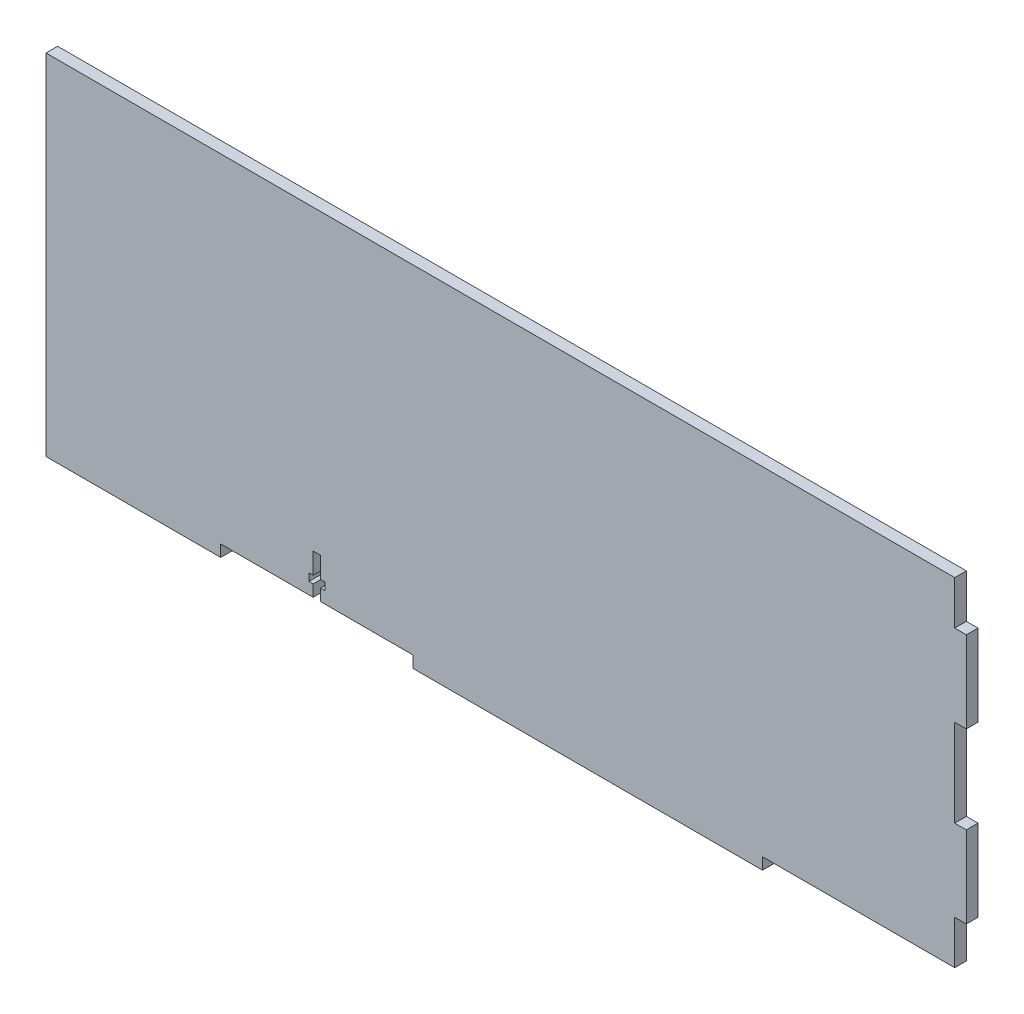
ISO-10303-21;
HEADER;
FILE_DESCRIPTION(('STEP AP214'),'2;1');
FILE_NAME('part.step','',(''),(''),'','','');
FILE_SCHEMA(('AUTOMOTIVE_DESIGN { 1 0 10303 214 1 1 1 1 }'));
ENDSEC;
DATA;
#1=APPLICATION_CONTEXT('core data for automotive mechanical design processes');
#2=APPLICATION_PROTOCOL_DEFINITION('international standard','automotive_design',2000,#1);
#3=PRODUCT_CONTEXT('',#1,'mechanical');
#4=PRODUCT('Part','Part','',(#3));
#5=PRODUCT_RELATED_PRODUCT_CATEGORY('part','',(#4));
#6=PRODUCT_DEFINITION_FORMATION('','',#4);
#7=PRODUCT_DEFINITION_CONTEXT('part definition',#1,'design');
#8=PRODUCT_DEFINITION('design','',#6,#7);
#9=PRODUCT_DEFINITION_SHAPE('','',#8);
#10=(LENGTH_UNIT() NAMED_UNIT(*) SI_UNIT(.MILLI.,.METRE.));
#11=(NAMED_UNIT(*) PLANE_ANGLE_UNIT() SI_UNIT($,.RADIAN.));
#12=(NAMED_UNIT(*) SI_UNIT($,.STERADIAN.) SOLID_ANGLE_UNIT());
#13=UNCERTAINTY_MEASURE_WITH_UNIT(LENGTH_MEASURE(1.E-05),#10,'distance_accuracy_value','');
#14=(GEOMETRIC_REPRESENTATION_CONTEXT(3) GLOBAL_UNCERTAINTY_ASSIGNED_CONTEXT((#13)) GLOBAL_UNIT_ASSIGNED_CONTEXT((#10,
#11,#12)) REPRESENTATION_CONTEXT('',''));
#15=CARTESIAN_POINT('',(0.,0.,0.));
#16=DIRECTION('',(0.,0.,1.));
#17=DIRECTION('',(1.,0.,0.));
#18=AXIS2_PLACEMENT_3D('',#15,#16,#17);
#19=CARTESIAN_POINT('',(0.,0.,5.));
#20=DIRECTION('',(0.,1.,0.));
#21=DIRECTION('',(0.,0.,1.));
#22=AXIS2_PLACEMENT_3D('',#19,#20,#21);
#23=PLANE('',#22);
#24=DIRECTION('',(0.,0.,1.));
#25=VECTOR('',#24,1.);
#26=CARTESIAN_POINT('',(504.65,-1.43484853190606E-13,-5.));
#27=LINE('',#26,#25);
#28=CARTESIAN_POINT('',(504.65,-1.43484853190606E-13,0.));
#29=VERTEX_POINT('',#28);
#30=CARTESIAN_POINT('',(504.65,-1.43484853190606E-13,5.));
#31=VERTEX_POINT('',#30);
#32=EDGE_CURVE('E751',#29,#31,#27,.T.);
#33=ORIENTED_EDGE('',*,*,#32,.T.);
#34=DIRECTION('',(1.,0.,0.));
#35=VECTOR('',#34,1.);
#36=CARTESIAN_POINT('',(0.,0.,5.));
#37=LINE('',#36,#35);
#38=CARTESIAN_POINT('',(465.,0.,5.));
#39=VERTEX_POINT('',#38);
#40=EDGE_CURVE('E624',#39,#31,#37,.T.);
#41=ORIENTED_EDGE('',*,*,#40,.F.);
#42=DIRECTION('',(0.,0.,-1.));
#43=VECTOR('',#42,1.);
#44=CARTESIAN_POINT('',(465.,0.,5.));
#45=LINE('',#44,#43);
#46=CARTESIAN_POINT('',(465.,0.,0.));
#47=VERTEX_POINT('',#46);
#48=EDGE_CURVE('E675',#39,#47,#45,.T.);
#49=ORIENTED_EDGE('',*,*,#48,.T.);
#50=DIRECTION('',(1.,0.,0.));
#51=VECTOR('',#50,1.);
#52=CARTESIAN_POINT('',(0.,0.,0.));
#53=LINE('',#52,#51);
#54=EDGE_CURVE('E640',#47,#29,#53,.T.);
#55=ORIENTED_EDGE('',*,*,#54,.T.);
#56=EDGE_LOOP('',(#33,#41,#49,#55));
#57=FACE_BOUND('',#56,.T.);
#58=ADVANCED_FACE('F397',(#57),#23,.F.);
#59=CARTESIAN_POINT('',(697.5,0.,0.));
#60=VERTEX_POINT('',#59);
#61=CARTESIAN_POINT('',(780.,0.,0.));
#62=VERTEX_POINT('',#61);
#63=EDGE_CURVE('E642',#60,#62,#53,.T.);
#64=ORIENTED_EDGE('',*,*,#63,.T.);
#65=DIRECTION('',(0.,0.,-1.));
#66=VECTOR('',#65,1.);
#67=CARTESIAN_POINT('',(780.,0.,5.));
#68=LINE('',#67,#66);
#69=CARTESIAN_POINT('',(780.,0.,5.));
#70=VERTEX_POINT('',#69);
#71=EDGE_CURVE('E663',#70,#62,#68,.T.);
#72=ORIENTED_EDGE('',*,*,#71,.F.);
#73=CARTESIAN_POINT('',(697.5,0.,5.));
#74=VERTEX_POINT('',#73);
#75=EDGE_CURVE('E630',#74,#70,#37,.T.);
#76=ORIENTED_EDGE('',*,*,#75,.F.);
#77=DIRECTION('',(0.,0.,-1.));
#78=VECTOR('',#77,1.);
#79=CARTESIAN_POINT('',(697.5,0.,5.));
#80=LINE('',#79,#78);
#81=EDGE_CURVE('E666',#74,#60,#80,.T.);
#82=ORIENTED_EDGE('',*,*,#81,.T.);
#83=EDGE_LOOP('',(#64,#72,#76,#82));
#84=FACE_BOUND('',#83,.T.);
#85=ADVANCED_FACE('F902',(#84),#23,.F.);
#86=CARTESIAN_POINT('',(507.85,-1.48689023618536E-13,5.));
#87=VERTEX_POINT('',#86);
#88=CARTESIAN_POINT('',(547.5,0.,5.));
#89=VERTEX_POINT('',#88);
#90=EDGE_CURVE('E614',#87,#89,#37,.T.);
#91=ORIENTED_EDGE('',*,*,#90,.F.);
#92=DIRECTION('',(0.,0.,1.));
#93=VECTOR('',#92,1.);
#94=CARTESIAN_POINT('',(507.85,-1.48689023618536E-13,-5.));
#95=LINE('',#94,#93);
#96=CARTESIAN_POINT('',(507.85,-1.48689023618536E-13,0.));
#97=VERTEX_POINT('',#96);
#98=EDGE_CURVE('E865',#97,#87,#95,.T.);
#99=ORIENTED_EDGE('',*,*,#98,.F.);
#100=CARTESIAN_POINT('',(547.5,0.,0.));
#101=VERTEX_POINT('',#100);
#102=EDGE_CURVE('E638',#97,#101,#53,.T.);
#103=ORIENTED_EDGE('',*,*,#102,.T.);
#104=DIRECTION('',(0.,0.,-1.));
#105=VECTOR('',#104,1.);
#106=CARTESIAN_POINT('',(547.5,0.,5.));
#107=LINE('',#106,#105);
#108=EDGE_CURVE('E672',#89,#101,#107,.T.);
#109=ORIENTED_EDGE('',*,*,#108,.F.);
#110=EDGE_LOOP('',(#91,#99,#103,#109));
#111=FACE_BOUND('',#110,.T.);
#112=ADVANCED_FACE('F891',(#111),#23,.F.);
#113=CARTESIAN_POINT('',(780.,0.,5.));
#114=DIRECTION('',(-1.,0.,0.));
#115=DIRECTION('',(0.,0.,1.));
#116=AXIS2_PLACEMENT_3D('',#113,#114,#115);
#117=PLANE('',#116);
#118=DIRECTION('',(0.,1.,0.));
#119=VECTOR('',#118,1.);
#120=CARTESIAN_POINT('',(780.,0.,5.));
#121=LINE('',#120,#119);
#122=CARTESIAN_POINT('',(780.,53.75,5.));
#123=VERTEX_POINT('',#122);
#124=CARTESIAN_POINT('',(780.,91.25,5.));
#125=VERTEX_POINT('',#124);
#126=EDGE_CURVE('E634',#123,#125,#121,.T.);
#127=ORIENTED_EDGE('',*,*,#126,.F.);
#128=DIRECTION('',(0.,0.,-1.));
#129=VECTOR('',#128,1.);
#130=CARTESIAN_POINT('',(780.,53.75,5.));
#131=LINE('',#130,#129);
#132=CARTESIAN_POINT('',(780.,53.75,0.));
#133=VERTEX_POINT('',#132);
#134=EDGE_CURVE('E699',#123,#133,#131,.T.);
#135=ORIENTED_EDGE('',*,*,#134,.T.);
#136=DIRECTION('',(0.,1.,0.));
#137=VECTOR('',#136,1.);
#138=CARTESIAN_POINT('',(780.,0.,0.));
#139=LINE('',#138,#137);
#140=CARTESIAN_POINT('',(780.,91.25,0.));
#141=VERTEX_POINT('',#140);
#142=EDGE_CURVE('E658',#133,#141,#139,.T.);
#143=ORIENTED_EDGE('',*,*,#142,.T.);
#144=DIRECTION('',(0.,0.,-1.));
#145=VECTOR('',#144,1.);
#146=CARTESIAN_POINT('',(780.,91.25,5.));
#147=LINE('',#146,#145);
#148=EDGE_CURVE('E701',#125,#141,#147,.T.);
#149=ORIENTED_EDGE('',*,*,#148,.F.);
#150=EDGE_LOOP('',(#127,#135,#143,#149));
#151=FACE_BOUND('',#150,.T.);
#152=ADVANCED_FACE('F921',(#151),#117,.F.);
#153=CARTESIAN_POINT('',(780.,126.25,5.));
#154=VERTEX_POINT('',#153);
#155=CARTESIAN_POINT('',(780.,145.,5.));
#156=VERTEX_POINT('',#155);
#157=EDGE_CURVE('E635',#154,#156,#121,.T.);
#158=ORIENTED_EDGE('',*,*,#157,.F.);
#159=DIRECTION('',(0.,0.,-1.));
#160=VECTOR('',#159,1.);
#161=CARTESIAN_POINT('',(780.,126.25,5.));
#162=LINE('',#161,#160);
#163=CARTESIAN_POINT('',(780.,126.25,0.));
#164=VERTEX_POINT('',#163);
#165=EDGE_CURVE('E678',#154,#164,#162,.T.);
#166=ORIENTED_EDGE('',*,*,#165,.T.);
#167=CARTESIAN_POINT('',(780.,145.,0.));
#168=VERTEX_POINT('',#167);
#169=EDGE_CURVE('E659',#164,#168,#139,.T.);
#170=ORIENTED_EDGE('',*,*,#169,.T.);
#171=DIRECTION('',(0.,0.,-1.));
#172=VECTOR('',#171,1.);
#173=CARTESIAN_POINT('',(780.,145.,5.));
#174=LINE('',#173,#172);
#175=EDGE_CURVE('E637',#156,#168,#174,.T.);
#176=ORIENTED_EDGE('',*,*,#175,.F.);
#177=EDGE_LOOP('',(#158,#166,#170,#176));
#178=FACE_BOUND('',#177,.T.);
#179=ADVANCED_FACE('F882',(#178),#117,.F.);
#180=DIRECTION('',(0.,0.,-1.));
#181=VECTOR('',#180,1.);
#182=CARTESIAN_POINT('',(780.,18.75,5.));
#183=LINE('',#182,#181);
#184=CARTESIAN_POINT('',(780.,18.75,5.));
#185=VERTEX_POINT('',#184);
#186=CARTESIAN_POINT('',(780.,18.75,0.));
#187=VERTEX_POINT('',#186);
#188=EDGE_CURVE('E405',#185,#187,#183,.T.);
#189=ORIENTED_EDGE('',*,*,#188,.F.);
#190=EDGE_CURVE('E631',#70,#185,#121,.T.);
#191=ORIENTED_EDGE('',*,*,#190,.F.);
#192=ORIENTED_EDGE('',*,*,#71,.T.);
#193=EDGE_CURVE('E616',#62,#187,#139,.T.);
#194=ORIENTED_EDGE('',*,*,#193,.T.);
#195=EDGE_LOOP('',(#189,#191,#192,#194));
#196=FACE_BOUND('',#195,.T.);
#197=ADVANCED_FACE('F906',(#196),#117,.F.);
#198=CARTESIAN_POINT('',(0.,145.,5.));
#199=DIRECTION('',(0.,1.,0.));
#200=DIRECTION('',(0.,0.,1.));
#201=AXIS2_PLACEMENT_3D('',#198,#199,#200);
#202=PLANE('',#201);
#203=DIRECTION('',(0.,0.,-1.));
#204=VECTOR('',#203,1.);
#205=CARTESIAN_POINT('',(390.,145.,5.));
#206=LINE('',#205,#204);
#207=CARTESIAN_POINT('',(390.,145.,5.));
#208=VERTEX_POINT('',#207);
#209=CARTESIAN_POINT('',(390.,145.,0.));
#210=VERTEX_POINT('',#209);
#211=EDGE_CURVE('E789',#208,#210,#206,.T.);
#212=ORIENTED_EDGE('',*,*,#211,.F.);
#213=DIRECTION('',(1.,0.,0.));
#214=VECTOR('',#213,1.);
#215=CARTESIAN_POINT('',(0.,145.,5.));
#216=LINE('',#215,#214);
#217=EDGE_CURVE('E605',#208,#156,#216,.T.);
#218=ORIENTED_EDGE('',*,*,#217,.T.);
#219=ORIENTED_EDGE('',*,*,#175,.T.);
#220=DIRECTION('',(1.,0.,0.));
#221=VECTOR('',#220,1.);
#222=CARTESIAN_POINT('',(0.,145.,0.));
#223=LINE('',#222,#221);
#224=EDGE_CURVE('E612',#210,#168,#223,.T.);
#225=ORIENTED_EDGE('',*,*,#224,.F.);
#226=EDGE_LOOP('',(#212,#218,#219,#225));
#227=FACE_BOUND('',#226,.T.);
#228=ADVANCED_FACE('F880',(#227),#202,.T.);
#229=CARTESIAN_POINT('',(0.,-5.,5.));
#230=DIRECTION('',(0.,-1.,0.));
#231=DIRECTION('',(0.,0.,-1.));
#232=AXIS2_PLACEMENT_3D('',#229,#230,#231);
#233=PLANE('',#232);
#234=DIRECTION('',(-1.,0.,0.));
#235=VECTOR('',#234,1.);
#236=CARTESIAN_POINT('',(0.,-5.,0.));
#237=LINE('',#236,#235);
#238=CARTESIAN_POINT('',(697.5,-5.,0.));
#239=VERTEX_POINT('',#238);
#240=CARTESIAN_POINT('',(547.5,-5.,0.));
#241=VERTEX_POINT('',#240);
#242=EDGE_CURVE('E651',#239,#241,#237,.T.);
#243=ORIENTED_EDGE('',*,*,#242,.F.);
#244=DIRECTION('',(0.,0.,-1.));
#245=VECTOR('',#244,1.);
#246=CARTESIAN_POINT('',(697.5,-5.,5.));
#247=LINE('',#246,#245);
#248=CARTESIAN_POINT('',(697.5,-5.,5.));
#249=VERTEX_POINT('',#248);
#250=EDGE_CURVE('E668',#249,#239,#247,.T.);
#251=ORIENTED_EDGE('',*,*,#250,.F.);
#252=DIRECTION('',(-1.,0.,0.));
#253=VECTOR('',#252,1.);
#254=CARTESIAN_POINT('',(0.,-5.,5.));
#255=LINE('',#254,#253);
#256=CARTESIAN_POINT('',(547.5,-5.,5.));
#257=VERTEX_POINT('',#256);
#258=EDGE_CURVE('E623',#249,#257,#255,.T.);
#259=ORIENTED_EDGE('',*,*,#258,.T.);
#260=DIRECTION('',(0.,0.,-1.));
#261=VECTOR('',#260,1.);
#262=CARTESIAN_POINT('',(547.5,-5.,5.));
#263=LINE('',#262,#261);
#264=EDGE_CURVE('E670',#257,#241,#263,.T.);
#265=ORIENTED_EDGE('',*,*,#264,.T.);
#266=EDGE_LOOP('',(#243,#251,#259,#265));
#267=FACE_BOUND('',#266,.T.);
#268=ADVANCED_FACE('F898',(#267),#233,.T.);
#269=CARTESIAN_POINT('',(697.5,0.,5.));
#270=DIRECTION('',(1.,0.,0.));
#271=DIRECTION('',(0.,0.,-1.));
#272=AXIS2_PLACEMENT_3D('',#269,#270,#271);
#273=PLANE('',#272);
#274=DIRECTION('',(0.,-1.,0.));
#275=VECTOR('',#274,1.);
#276=CARTESIAN_POINT('',(697.5,0.,0.));
#277=LINE('',#276,#275);
#278=EDGE_CURVE('E654',#60,#239,#277,.T.);
#279=ORIENTED_EDGE('',*,*,#278,.F.);
#280=ORIENTED_EDGE('',*,*,#81,.F.);
#281=DIRECTION('',(0.,-1.,0.));
#282=VECTOR('',#281,1.);
#283=CARTESIAN_POINT('',(697.5,0.,5.));
#284=LINE('',#283,#282);
#285=EDGE_CURVE('E627',#74,#249,#284,.T.);
#286=ORIENTED_EDGE('',*,*,#285,.T.);
#287=ORIENTED_EDGE('',*,*,#250,.T.);
#288=EDGE_LOOP('',(#279,#280,#286,#287));
#289=FACE_BOUND('',#288,.T.);
#290=ADVANCED_FACE('F901',(#289),#273,.T.);
#291=CARTESIAN_POINT('',(547.5,0.,5.));
#292=DIRECTION('',(1.,0.,0.));
#293=DIRECTION('',(0.,0.,-1.));
#294=AXIS2_PLACEMENT_3D('',#291,#292,#293);
#295=PLANE('',#294);
#296=DIRECTION('',(0.,-1.,0.));
#297=VECTOR('',#296,1.);
#298=CARTESIAN_POINT('',(547.5,0.,0.));
#299=LINE('',#298,#297);
#300=EDGE_CURVE('E648',#101,#241,#299,.T.);
#301=ORIENTED_EDGE('',*,*,#300,.T.);
#302=ORIENTED_EDGE('',*,*,#264,.F.);
#303=DIRECTION('',(0.,-1.,0.));
#304=VECTOR('',#303,1.);
#305=CARTESIAN_POINT('',(547.5,0.,5.));
#306=LINE('',#305,#304);
#307=EDGE_CURVE('E621',#89,#257,#306,.T.);
#308=ORIENTED_EDGE('',*,*,#307,.F.);
#309=ORIENTED_EDGE('',*,*,#108,.T.);
#310=EDGE_LOOP('',(#301,#302,#308,#309));
#311=FACE_BOUND('',#310,.T.);
#312=ADVANCED_FACE('F895',(#311),#295,.F.);
#313=CARTESIAN_POINT('',(0.,0.,0.));
#314=DIRECTION('',(0.,0.,1.));
#315=DIRECTION('',(1.,0.,0.));
#316=AXIS2_PLACEMENT_3D('',#313,#314,#315);
#317=PLANE('',#316);
#318=DIRECTION('',(1.,0.,0.));
#319=VECTOR('',#318,1.);
#320=CARTESIAN_POINT('',(0.,-5.,0.));
#321=LINE('',#320,#319);
#322=CARTESIAN_POINT('',(390.,-5.,0.));
#323=VERTEX_POINT('',#322);
#324=CARTESIAN_POINT('',(465.,-5.,0.));
#325=VERTEX_POINT('',#324);
#326=EDGE_CURVE('E643',#323,#325,#321,.T.);
#327=ORIENTED_EDGE('',*,*,#326,.F.);
#328=DIRECTION('',(0.,1.,0.));
#329=VECTOR('',#328,1.);
#330=CARTESIAN_POINT('',(390.,0.,0.));
#331=LINE('',#330,#329);
#332=EDGE_CURVE('E412',#323,#210,#331,.T.);
#333=ORIENTED_EDGE('',*,*,#332,.T.);
#334=ORIENTED_EDGE('',*,*,#224,.T.);
#335=ORIENTED_EDGE('',*,*,#169,.F.);
#336=DIRECTION('',(1.,0.,0.));
#337=VECTOR('',#336,1.);
#338=CARTESIAN_POINT('',(780.,126.25,0.));
#339=LINE('',#338,#337);
#340=CARTESIAN_POINT('',(785.,126.25,0.));
#341=VERTEX_POINT('',#340);
#342=EDGE_CURVE('E715',#164,#341,#339,.T.);
#343=ORIENTED_EDGE('',*,*,#342,.T.);
#344=DIRECTION('',(0.,-1.,0.));
#345=VECTOR('',#344,1.);
#346=CARTESIAN_POINT('',(785.,126.25,0.));
#347=LINE('',#346,#345);
#348=CARTESIAN_POINT('',(785.,91.25,0.));
#349=VERTEX_POINT('',#348);
#350=EDGE_CURVE('E718',#341,#349,#347,.T.);
#351=ORIENTED_EDGE('',*,*,#350,.T.);
#352=DIRECTION('',(1.,0.,0.));
#353=VECTOR('',#352,1.);
#354=CARTESIAN_POINT('',(780.,91.25,0.));
#355=LINE('',#354,#353);
#356=EDGE_CURVE('E709',#141,#349,#355,.T.);
#357=ORIENTED_EDGE('',*,*,#356,.F.);
#358=ORIENTED_EDGE('',*,*,#142,.F.);
#359=DIRECTION('',(1.,0.,0.));
#360=VECTOR('',#359,1.);
#361=CARTESIAN_POINT('',(780.,53.75,0.));
#362=LINE('',#361,#360);
#363=CARTESIAN_POINT('',(785.,53.75,0.));
#364=VERTEX_POINT('',#363);
#365=EDGE_CURVE('E683',#133,#364,#362,.T.);
#366=ORIENTED_EDGE('',*,*,#365,.T.);
#367=DIRECTION('',(0.,1.,0.));
#368=VECTOR('',#367,1.);
#369=CARTESIAN_POINT('',(785.,18.75,0.));
#370=LINE('',#369,#368);
#371=CARTESIAN_POINT('',(785.,18.75,0.));
#372=VERTEX_POINT('',#371);
#373=EDGE_CURVE('E692',#372,#364,#370,.T.);
#374=ORIENTED_EDGE('',*,*,#373,.F.);
#375=DIRECTION('',(1.,0.,0.));
#376=VECTOR('',#375,1.);
#377=CARTESIAN_POINT('',(780.,18.75,0.));
#378=LINE('',#377,#376);
#379=EDGE_CURVE('E689',#187,#372,#378,.T.);
#380=ORIENTED_EDGE('',*,*,#379,.F.);
#381=ORIENTED_EDGE('',*,*,#193,.F.);
#382=ORIENTED_EDGE('',*,*,#63,.F.);
#383=ORIENTED_EDGE('',*,*,#278,.T.);
#384=ORIENTED_EDGE('',*,*,#242,.T.);
#385=ORIENTED_EDGE('',*,*,#300,.F.);
#386=ORIENTED_EDGE('',*,*,#102,.F.);
#387=DIRECTION('',(0.,1.,0.));
#388=VECTOR('',#387,1.);
#389=CARTESIAN_POINT('',(507.85,0.,0.));
#390=LINE('',#389,#388);
#391=CARTESIAN_POINT('',(507.85,4.99999999999985,0.));
#392=VERTEX_POINT('',#391);
#393=EDGE_CURVE('E761',#97,#392,#390,.T.);
#394=ORIENTED_EDGE('',*,*,#393,.T.);
#395=DIRECTION('',(1.,0.,0.));
#396=VECTOR('',#395,1.);
#397=CARTESIAN_POINT('',(0.,5.00000000000083,0.));
#398=LINE('',#397,#396);
#399=CARTESIAN_POINT('',(509.65,4.99999999999985,0.));
#400=VERTEX_POINT('',#399);
#401=EDGE_CURVE('E764',#392,#400,#398,.T.);
#402=ORIENTED_EDGE('',*,*,#401,.T.);
#403=DIRECTION('',(0.,1.,0.));
#404=VECTOR('',#403,1.);
#405=CARTESIAN_POINT('',(509.65,0.,0.));
#406=LINE('',#405,#404);
#407=CARTESIAN_POINT('',(509.65,8.19999999999985,0.));
#408=VERTEX_POINT('',#407);
#409=EDGE_CURVE('E772',#400,#408,#406,.T.);
#410=ORIENTED_EDGE('',*,*,#409,.T.);
#411=DIRECTION('',(-1.,0.,0.));
#412=VECTOR('',#411,1.);
#413=CARTESIAN_POINT('',(0.,8.20000000000083,0.));
#414=LINE('',#413,#412);
#415=CARTESIAN_POINT('',(507.85,8.19999999999985,0.));
#416=VERTEX_POINT('',#415);
#417=EDGE_CURVE('E719',#408,#416,#414,.T.);
#418=ORIENTED_EDGE('',*,*,#417,.T.);
#419=DIRECTION('',(0.,1.,0.));
#420=VECTOR('',#419,1.);
#421=CARTESIAN_POINT('',(507.85,0.,0.));
#422=LINE('',#421,#420);
#423=CARTESIAN_POINT('',(507.85,17.1999999999998,0.));
#424=VERTEX_POINT('',#423);
#425=EDGE_CURVE('E777',#416,#424,#422,.T.);
#426=ORIENTED_EDGE('',*,*,#425,.T.);
#427=DIRECTION('',(-1.,0.,0.));
#428=VECTOR('',#427,1.);
#429=CARTESIAN_POINT('',(0.,17.1999999999998,0.));
#430=LINE('',#429,#428);
#431=CARTESIAN_POINT('',(504.65,17.1999999999998,0.));
#432=VERTEX_POINT('',#431);
#433=EDGE_CURVE('E826',#424,#432,#430,.T.);
#434=ORIENTED_EDGE('',*,*,#433,.T.);
#435=DIRECTION('',(0.,1.,0.));
#436=VECTOR('',#435,1.);
#437=CARTESIAN_POINT('',(504.65,0.,0.));
#438=LINE('',#437,#436);
#439=CARTESIAN_POINT('',(504.65,8.19999999999985,0.));
#440=VERTEX_POINT('',#439);
#441=EDGE_CURVE('E828',#440,#432,#438,.T.);
#442=ORIENTED_EDGE('',*,*,#441,.F.);
#443=DIRECTION('',(1.,0.,0.));
#444=VECTOR('',#443,1.);
#445=CARTESIAN_POINT('',(0.,8.20000000000083,0.));
#446=LINE('',#445,#444);
#447=CARTESIAN_POINT('',(502.85,8.19999999999986,0.));
#448=VERTEX_POINT('',#447);
#449=EDGE_CURVE('E830',#448,#440,#446,.T.);
#450=ORIENTED_EDGE('',*,*,#449,.F.);
#451=DIRECTION('',(0.,1.,0.));
#452=VECTOR('',#451,1.);
#453=CARTESIAN_POINT('',(502.85,0.,0.));
#454=LINE('',#453,#452);
#455=CARTESIAN_POINT('',(502.85,4.99999999999986,0.));
#456=VERTEX_POINT('',#455);
#457=EDGE_CURVE('E766',#456,#448,#454,.T.);
#458=ORIENTED_EDGE('',*,*,#457,.F.);
#459=DIRECTION('',(-1.,0.,0.));
#460=VECTOR('',#459,1.);
#461=CARTESIAN_POINT('',(0.,5.00000000000083,0.));
#462=LINE('',#461,#460);
#463=CARTESIAN_POINT('',(504.65,4.99999999999985,0.));
#464=VERTEX_POINT('',#463);
#465=EDGE_CURVE('E758',#464,#456,#462,.T.);
#466=ORIENTED_EDGE('',*,*,#465,.F.);
#467=DIRECTION('',(0.,1.,0.));
#468=VECTOR('',#467,1.);
#469=CARTESIAN_POINT('',(504.65,0.,0.));
#470=LINE('',#469,#468);
#471=EDGE_CURVE('E756',#29,#464,#470,.T.);
#472=ORIENTED_EDGE('',*,*,#471,.F.);
#473=ORIENTED_EDGE('',*,*,#54,.F.);
#474=DIRECTION('',(0.,1.,0.));
#475=VECTOR('',#474,1.);
#476=CARTESIAN_POINT('',(465.,0.,0.));
#477=LINE('',#476,#475);
#478=EDGE_CURVE('E641',#325,#47,#477,.T.);
#479=ORIENTED_EDGE('',*,*,#478,.F.);
#480=EDGE_LOOP('',(#327,#333,#334,#335,#343,#351,#357,#358,#366,#374,#380,#381,#382,#383,#384,
#385,#386,#394,#402,#410,#418,#426,#434,#442,#450,#458,#466,#472,#473,#479));
#481=FACE_BOUND('',#480,.T.);
#482=ADVANCED_FACE('F737',(#481),#317,.F.);
#483=CARTESIAN_POINT('',(0.,0.,5.));
#484=DIRECTION('',(0.,0.,1.));
#485=DIRECTION('',(1.,0.,0.));
#486=AXIS2_PLACEMENT_3D('',#483,#484,#485);
#487=PLANE('',#486);
#488=DIRECTION('',(0.,1.,0.));
#489=VECTOR('',#488,1.);
#490=CARTESIAN_POINT('',(390.,-5.,5.));
#491=LINE('',#490,#489);
#492=CARTESIAN_POINT('',(390.,-5.,5.));
#493=VERTEX_POINT('',#492);
#494=EDGE_CURVE('E593',#493,#208,#491,.T.);
#495=ORIENTED_EDGE('',*,*,#494,.F.);
#496=DIRECTION('',(1.,0.,0.));
#497=VECTOR('',#496,1.);
#498=CARTESIAN_POINT('',(0.,-5.,5.));
#499=LINE('',#498,#497);
#500=CARTESIAN_POINT('',(465.,-5.,5.));
#501=VERTEX_POINT('',#500);
#502=EDGE_CURVE('E602',#493,#501,#499,.T.);
#503=ORIENTED_EDGE('',*,*,#502,.T.);
#504=DIRECTION('',(0.,1.,0.));
#505=VECTOR('',#504,1.);
#506=CARTESIAN_POINT('',(465.,0.,5.));
#507=LINE('',#506,#505);
#508=EDGE_CURVE('E611',#501,#39,#507,.T.);
#509=ORIENTED_EDGE('',*,*,#508,.T.);
#510=ORIENTED_EDGE('',*,*,#40,.T.);
#511=DIRECTION('',(0.,1.,0.));
#512=VECTOR('',#511,1.);
#513=CARTESIAN_POINT('',(504.65,-1.43484853190606E-13,5.));
#514=LINE('',#513,#512);
#515=CARTESIAN_POINT('',(504.65,4.99999999999985,5.));
#516=VERTEX_POINT('',#515);
#517=EDGE_CURVE('E803',#31,#516,#514,.T.);
#518=ORIENTED_EDGE('',*,*,#517,.T.);
#519=DIRECTION('',(-1.,0.,0.));
#520=VECTOR('',#519,1.);
#521=CARTESIAN_POINT('',(504.65,4.99999999999985,5.));
#522=LINE('',#521,#520);
#523=CARTESIAN_POINT('',(502.85,4.99999999999986,5.));
#524=VERTEX_POINT('',#523);
#525=EDGE_CURVE('E806',#516,#524,#522,.T.);
#526=ORIENTED_EDGE('',*,*,#525,.T.);
#527=DIRECTION('',(0.,1.,0.));
#528=VECTOR('',#527,1.);
#529=CARTESIAN_POINT('',(502.85,4.99999999999986,5.));
#530=LINE('',#529,#528);
#531=CARTESIAN_POINT('',(502.85,8.19999999999986,5.));
#532=VERTEX_POINT('',#531);
#533=EDGE_CURVE('E809',#524,#532,#530,.T.);
#534=ORIENTED_EDGE('',*,*,#533,.T.);
#535=DIRECTION('',(1.,0.,0.));
#536=VECTOR('',#535,1.);
#537=CARTESIAN_POINT('',(502.85,8.19999999999986,5.));
#538=LINE('',#537,#536);
#539=CARTESIAN_POINT('',(504.65,8.19999999999985,5.));
#540=VERTEX_POINT('',#539);
#541=EDGE_CURVE('E812',#532,#540,#538,.T.);
#542=ORIENTED_EDGE('',*,*,#541,.T.);
#543=DIRECTION('',(0.,1.,0.));
#544=VECTOR('',#543,1.);
#545=CARTESIAN_POINT('',(504.65,8.19999999999985,5.));
#546=LINE('',#545,#544);
#547=CARTESIAN_POINT('',(504.65,17.1999999999998,5.));
#548=VERTEX_POINT('',#547);
#549=EDGE_CURVE('E815',#540,#548,#546,.T.);
#550=ORIENTED_EDGE('',*,*,#549,.T.);
#551=DIRECTION('',(-1.,0.,0.));
#552=VECTOR('',#551,1.);
#553=CARTESIAN_POINT('',(507.85,17.1999999999998,5.));
#554=LINE('',#553,#552);
#555=CARTESIAN_POINT('',(507.85,17.1999999999998,5.));
#556=VERTEX_POINT('',#555);
#557=EDGE_CURVE('E818',#556,#548,#554,.T.);
#558=ORIENTED_EDGE('',*,*,#557,.F.);
#559=DIRECTION('',(0.,1.,0.));
#560=VECTOR('',#559,1.);
#561=CARTESIAN_POINT('',(507.85,8.19999999999985,5.));
#562=LINE('',#561,#560);
#563=CARTESIAN_POINT('',(507.85,8.19999999999985,5.));
#564=VERTEX_POINT('',#563);
#565=EDGE_CURVE('E821',#564,#556,#562,.T.);
#566=ORIENTED_EDGE('',*,*,#565,.F.);
#567=DIRECTION('',(-1.,0.,0.));
#568=VECTOR('',#567,1.);
#569=CARTESIAN_POINT('',(509.65,8.19999999999985,5.));
#570=LINE('',#569,#568);
#571=CARTESIAN_POINT('',(509.65,8.19999999999985,5.));
#572=VERTEX_POINT('',#571);
#573=EDGE_CURVE('E419',#572,#564,#570,.T.);
#574=ORIENTED_EDGE('',*,*,#573,.F.);
#575=DIRECTION('',(0.,1.,0.));
#576=VECTOR('',#575,1.);
#577=CARTESIAN_POINT('',(509.65,4.99999999999985,5.));
#578=LINE('',#577,#576);
#579=CARTESIAN_POINT('',(509.65,4.99999999999985,5.));
#580=VERTEX_POINT('',#579);
#581=EDGE_CURVE('E787',#580,#572,#578,.T.);
#582=ORIENTED_EDGE('',*,*,#581,.F.);
#583=DIRECTION('',(1.,0.,0.));
#584=VECTOR('',#583,1.);
#585=CARTESIAN_POINT('',(507.85,4.99999999999985,5.));
#586=LINE('',#585,#584);
#587=CARTESIAN_POINT('',(507.85,4.99999999999985,5.));
#588=VERTEX_POINT('',#587);
#589=EDGE_CURVE('E797',#588,#580,#586,.T.);
#590=ORIENTED_EDGE('',*,*,#589,.F.);
#591=DIRECTION('',(0.,1.,0.));
#592=VECTOR('',#591,1.);
#593=CARTESIAN_POINT('',(507.85,-1.48689023618536E-13,5.));
#594=LINE('',#593,#592);
#595=EDGE_CURVE('E800',#87,#588,#594,.T.);
#596=ORIENTED_EDGE('',*,*,#595,.F.);
#597=ORIENTED_EDGE('',*,*,#90,.T.);
#598=ORIENTED_EDGE('',*,*,#307,.T.);
#599=ORIENTED_EDGE('',*,*,#258,.F.);
#600=ORIENTED_EDGE('',*,*,#285,.F.);
#601=ORIENTED_EDGE('',*,*,#75,.T.);
#602=ORIENTED_EDGE('',*,*,#190,.T.);
#603=DIRECTION('',(1.,0.,0.));
#604=VECTOR('',#603,1.);
#605=CARTESIAN_POINT('',(780.,18.75,5.));
#606=LINE('',#605,#604);
#607=CARTESIAN_POINT('',(785.,18.75,5.));
#608=VERTEX_POINT('',#607);
#609=EDGE_CURVE('E679',#185,#608,#606,.T.);
#610=ORIENTED_EDGE('',*,*,#609,.T.);
#611=DIRECTION('',(0.,1.,0.));
#612=VECTOR('',#611,1.);
#613=CARTESIAN_POINT('',(785.,18.75,5.));
#614=LINE('',#613,#612);
#615=CARTESIAN_POINT('',(785.,53.75,5.));
#616=VERTEX_POINT('',#615);
#617=EDGE_CURVE('E682',#608,#616,#614,.T.);
#618=ORIENTED_EDGE('',*,*,#617,.T.);
#619=DIRECTION('',(1.,0.,0.));
#620=VECTOR('',#619,1.);
#621=CARTESIAN_POINT('',(780.,53.75,5.));
#622=LINE('',#621,#620);
#623=EDGE_CURVE('E685',#123,#616,#622,.T.);
#624=ORIENTED_EDGE('',*,*,#623,.F.);
#625=ORIENTED_EDGE('',*,*,#126,.T.);
#626=DIRECTION('',(1.,0.,0.));
#627=VECTOR('',#626,1.);
#628=CARTESIAN_POINT('',(780.,91.25,5.));
#629=LINE('',#628,#627);
#630=CARTESIAN_POINT('',(785.,91.25,5.));
#631=VERTEX_POINT('',#630);
#632=EDGE_CURVE('E712',#125,#631,#629,.T.);
#633=ORIENTED_EDGE('',*,*,#632,.T.);
#634=DIRECTION('',(0.,-1.,0.));
#635=VECTOR('',#634,1.);
#636=CARTESIAN_POINT('',(785.,126.25,5.));
#637=LINE('',#636,#635);
#638=CARTESIAN_POINT('',(785.,126.25,5.));
#639=VERTEX_POINT('',#638);
#640=EDGE_CURVE('E708',#639,#631,#637,.T.);
#641=ORIENTED_EDGE('',*,*,#640,.F.);
#642=DIRECTION('',(1.,0.,0.));
#643=VECTOR('',#642,1.);
#644=CARTESIAN_POINT('',(780.,126.25,5.));
#645=LINE('',#644,#643);
#646=EDGE_CURVE('E705',#154,#639,#645,.T.);
#647=ORIENTED_EDGE('',*,*,#646,.F.);
#648=ORIENTED_EDGE('',*,*,#157,.T.);
#649=ORIENTED_EDGE('',*,*,#217,.F.);
#650=EDGE_LOOP('',(#495,#503,#509,#510,#518,#526,#534,#542,#550,#558,#566,#574,#582,#590,#596,
#597,#598,#599,#600,#601,#602,#610,#618,#624,#625,#633,#641,#647,#648,#649));
#651=FACE_BOUND('',#650,.T.);
#652=ADVANCED_FACE('F600',(#651),#487,.T.);
#653=CARTESIAN_POINT('',(0.,-5.,5.));
#654=DIRECTION('',(0.,1.,0.));
#655=DIRECTION('',(0.,0.,1.));
#656=AXIS2_PLACEMENT_3D('',#653,#654,#655);
#657=PLANE('',#656);
#658=ORIENTED_EDGE('',*,*,#502,.F.);
#659=DIRECTION('',(0.,0.,-1.));
#660=VECTOR('',#659,1.);
#661=CARTESIAN_POINT('',(390.,-5.,5.));
#662=LINE('',#661,#660);
#663=EDGE_CURVE('E12',#493,#323,#662,.T.);
#664=ORIENTED_EDGE('',*,*,#663,.T.);
#665=ORIENTED_EDGE('',*,*,#326,.T.);
#666=DIRECTION('',(0.,0.,-1.));
#667=VECTOR('',#666,1.);
#668=CARTESIAN_POINT('',(465.,-5.,5.));
#669=LINE('',#668,#667);
#670=EDGE_CURVE('E609',#501,#325,#669,.T.);
#671=ORIENTED_EDGE('',*,*,#670,.F.);
#672=EDGE_LOOP('',(#658,#664,#665,#671));
#673=FACE_BOUND('',#672,.T.);
#674=ADVANCED_FACE('F607',(#673),#657,.F.);
#675=CARTESIAN_POINT('',(465.,0.,5.));
#676=DIRECTION('',(-1.,0.,0.));
#677=DIRECTION('',(0.,0.,1.));
#678=AXIS2_PLACEMENT_3D('',#675,#676,#677);
#679=PLANE('',#678);
#680=ORIENTED_EDGE('',*,*,#478,.T.);
#681=ORIENTED_EDGE('',*,*,#48,.F.);
#682=ORIENTED_EDGE('',*,*,#508,.F.);
#683=ORIENTED_EDGE('',*,*,#670,.T.);
#684=EDGE_LOOP('',(#680,#681,#682,#683));
#685=FACE_BOUND('',#684,.T.);
#686=ADVANCED_FACE('F947',(#685),#679,.F.);
#687=CARTESIAN_POINT('',(785.,18.75,5.));
#688=DIRECTION('',(-1.,0.,0.));
#689=DIRECTION('',(0.,0.,1.));
#690=AXIS2_PLACEMENT_3D('',#687,#688,#689);
#691=PLANE('',#690);
#692=ORIENTED_EDGE('',*,*,#373,.T.);
#693=DIRECTION('',(0.,0.,-1.));
#694=VECTOR('',#693,1.);
#695=CARTESIAN_POINT('',(785.,53.75,5.));
#696=LINE('',#695,#694);
#697=EDGE_CURVE('E688',#616,#364,#696,.T.);
#698=ORIENTED_EDGE('',*,*,#697,.F.);
#699=ORIENTED_EDGE('',*,*,#617,.F.);
#700=DIRECTION('',(0.,0.,-1.));
#701=VECTOR('',#700,1.);
#702=CARTESIAN_POINT('',(785.,18.75,5.));
#703=LINE('',#702,#701);
#704=EDGE_CURVE('E645',#608,#372,#703,.T.);
#705=ORIENTED_EDGE('',*,*,#704,.T.);
#706=EDGE_LOOP('',(#692,#698,#699,#705));
#707=FACE_BOUND('',#706,.T.);
#708=ADVANCED_FACE('F915',(#707),#691,.F.);
#709=CARTESIAN_POINT('',(780.,53.75,5.));
#710=DIRECTION('',(0.,1.,0.));
#711=DIRECTION('',(0.,0.,1.));
#712=AXIS2_PLACEMENT_3D('',#709,#710,#711);
#713=PLANE('',#712);
#714=ORIENTED_EDGE('',*,*,#365,.F.);
#715=ORIENTED_EDGE('',*,*,#134,.F.);
#716=ORIENTED_EDGE('',*,*,#623,.T.);
#717=ORIENTED_EDGE('',*,*,#697,.T.);
#718=EDGE_LOOP('',(#714,#715,#716,#717));
#719=FACE_BOUND('',#718,.T.);
#720=ADVANCED_FACE('F918',(#719),#713,.T.);
#721=CARTESIAN_POINT('',(780.,18.75,5.));
#722=DIRECTION('',(0.,1.,0.));
#723=DIRECTION('',(0.,0.,1.));
#724=AXIS2_PLACEMENT_3D('',#721,#722,#723);
#725=PLANE('',#724);
#726=ORIENTED_EDGE('',*,*,#379,.T.);
#727=ORIENTED_EDGE('',*,*,#704,.F.);
#728=ORIENTED_EDGE('',*,*,#609,.F.);
#729=ORIENTED_EDGE('',*,*,#188,.T.);
#730=EDGE_LOOP('',(#726,#727,#728,#729));
#731=FACE_BOUND('',#730,.T.);
#732=ADVANCED_FACE('F912',(#731),#725,.F.);
#733=CARTESIAN_POINT('',(780.,91.25,5.));
#734=DIRECTION('',(0.,1.,0.));
#735=DIRECTION('',(0.,0.,1.));
#736=AXIS2_PLACEMENT_3D('',#733,#734,#735);
#737=PLANE('',#736);
#738=ORIENTED_EDGE('',*,*,#356,.T.);
#739=DIRECTION('',(0.,0.,-1.));
#740=VECTOR('',#739,1.);
#741=CARTESIAN_POINT('',(785.,91.25,5.));
#742=LINE('',#741,#740);
#743=EDGE_CURVE('E693',#631,#349,#742,.T.);
#744=ORIENTED_EDGE('',*,*,#743,.F.);
#745=ORIENTED_EDGE('',*,*,#632,.F.);
#746=ORIENTED_EDGE('',*,*,#148,.T.);
#747=EDGE_LOOP('',(#738,#744,#745,#746));
#748=FACE_BOUND('',#747,.T.);
#749=ADVANCED_FACE('F925',(#748),#737,.F.);
#750=CARTESIAN_POINT('',(785.,126.25,5.));
#751=DIRECTION('',(1.,0.,0.));
#752=DIRECTION('',(0.,0.,-1.));
#753=AXIS2_PLACEMENT_3D('',#750,#751,#752);
#754=PLANE('',#753);
#755=ORIENTED_EDGE('',*,*,#350,.F.);
#756=DIRECTION('',(0.,0.,-1.));
#757=VECTOR('',#756,1.);
#758=CARTESIAN_POINT('',(785.,126.25,5.));
#759=LINE('',#758,#757);
#760=EDGE_CURVE('E714',#639,#341,#759,.T.);
#761=ORIENTED_EDGE('',*,*,#760,.F.);
#762=ORIENTED_EDGE('',*,*,#640,.T.);
#763=ORIENTED_EDGE('',*,*,#743,.T.);
#764=EDGE_LOOP('',(#755,#761,#762,#763));
#765=FACE_BOUND('',#764,.T.);
#766=ADVANCED_FACE('F733',(#765),#754,.T.);
#767=CARTESIAN_POINT('',(780.,126.25,5.));
#768=DIRECTION('',(0.,1.,0.));
#769=DIRECTION('',(0.,0.,1.));
#770=AXIS2_PLACEMENT_3D('',#767,#768,#769);
#771=PLANE('',#770);
#772=ORIENTED_EDGE('',*,*,#342,.F.);
#773=ORIENTED_EDGE('',*,*,#165,.F.);
#774=ORIENTED_EDGE('',*,*,#646,.T.);
#775=ORIENTED_EDGE('',*,*,#760,.T.);
#776=EDGE_LOOP('',(#772,#773,#774,#775));
#777=FACE_BOUND('',#776,.T.);
#778=ADVANCED_FACE('F399',(#777),#771,.T.);
#779=CARTESIAN_POINT('',(509.65,8.19999999999985,-5.));
#780=DIRECTION('',(0.,1.,0.));
#781=DIRECTION('',(-1.,0.,0.));
#782=AXIS2_PLACEMENT_3D('',#779,#780,#781);
#783=PLANE('',#782);
#784=DIRECTION('',(0.,0.,1.));
#785=VECTOR('',#784,1.);
#786=CARTESIAN_POINT('',(509.65,8.19999999999985,-5.));
#787=LINE('',#786,#785);
#788=EDGE_CURVE('E780',#408,#572,#787,.T.);
#789=ORIENTED_EDGE('',*,*,#788,.T.);
#790=ORIENTED_EDGE('',*,*,#573,.T.);
#791=DIRECTION('',(0.,0.,1.));
#792=VECTOR('',#791,1.);
#793=CARTESIAN_POINT('',(507.85,8.19999999999985,-5.));
#794=LINE('',#793,#792);
#795=EDGE_CURVE('E782',#416,#564,#794,.T.);
#796=ORIENTED_EDGE('',*,*,#795,.F.);
#797=ORIENTED_EDGE('',*,*,#417,.F.);
#798=EDGE_LOOP('',(#789,#790,#796,#797));
#799=FACE_BOUND('',#798,.T.);
#800=ADVANCED_FACE('F779',(#799),#783,.F.);
#801=CARTESIAN_POINT('',(509.65,4.99999999999985,-5.));
#802=DIRECTION('',(1.,0.,0.));
#803=DIRECTION('',(0.,0.,-1.));
#804=AXIS2_PLACEMENT_3D('',#801,#802,#803);
#805=PLANE('',#804);
#806=DIRECTION('',(0.,0.,1.));
#807=VECTOR('',#806,1.);
#808=CARTESIAN_POINT('',(509.65,4.99999999999985,-5.));
#809=LINE('',#808,#807);
#810=EDGE_CURVE('E788',#400,#580,#809,.T.);
#811=ORIENTED_EDGE('',*,*,#810,.T.);
#812=ORIENTED_EDGE('',*,*,#581,.T.);
#813=ORIENTED_EDGE('',*,*,#788,.F.);
#814=ORIENTED_EDGE('',*,*,#409,.F.);
#815=EDGE_LOOP('',(#811,#812,#813,#814));
#816=FACE_BOUND('',#815,.T.);
#817=ADVANCED_FACE('F784',(#816),#805,.F.);
#818=CARTESIAN_POINT('',(507.85,4.99999999999985,-5.));
#819=DIRECTION('',(0.,-1.,0.));
#820=DIRECTION('',(1.,0.,0.));
#821=AXIS2_PLACEMENT_3D('',#818,#819,#820);
#822=PLANE('',#821);
#823=DIRECTION('',(0.,0.,1.));
#824=VECTOR('',#823,1.);
#825=CARTESIAN_POINT('',(507.85,4.99999999999985,-5.));
#826=LINE('',#825,#824);
#827=EDGE_CURVE('E791',#392,#588,#826,.T.);
#828=ORIENTED_EDGE('',*,*,#827,.T.);
#829=ORIENTED_EDGE('',*,*,#589,.T.);
#830=ORIENTED_EDGE('',*,*,#810,.F.);
#831=ORIENTED_EDGE('',*,*,#401,.F.);
#832=EDGE_LOOP('',(#828,#829,#830,#831));
#833=FACE_BOUND('',#832,.T.);
#834=ADVANCED_FACE('F868',(#833),#822,.F.);
#835=CARTESIAN_POINT('',(507.85,-1.48689023618536E-13,-5.));
#836=DIRECTION('',(1.,0.,0.));
#837=DIRECTION('',(0.,0.,-1.));
#838=AXIS2_PLACEMENT_3D('',#835,#836,#837);
#839=PLANE('',#838);
#840=ORIENTED_EDGE('',*,*,#98,.T.);
#841=ORIENTED_EDGE('',*,*,#595,.T.);
#842=ORIENTED_EDGE('',*,*,#827,.F.);
#843=ORIENTED_EDGE('',*,*,#393,.F.);
#844=EDGE_LOOP('',(#840,#841,#842,#843));
#845=FACE_BOUND('',#844,.T.);
#846=ADVANCED_FACE('F872',(#845),#839,.F.);
#847=CARTESIAN_POINT('',(504.65,-1.43484853190606E-13,-5.));
#848=DIRECTION('',(1.,0.,0.));
#849=DIRECTION('',(0.,0.,-1.));
#850=AXIS2_PLACEMENT_3D('',#847,#848,#849);
#851=PLANE('',#850);
#852=ORIENTED_EDGE('',*,*,#471,.T.);
#853=DIRECTION('',(0.,0.,1.));
#854=VECTOR('',#853,1.);
#855=CARTESIAN_POINT('',(504.65,4.99999999999985,-5.));
#856=LINE('',#855,#854);
#857=EDGE_CURVE('E862',#464,#516,#856,.T.);
#858=ORIENTED_EDGE('',*,*,#857,.T.);
#859=ORIENTED_EDGE('',*,*,#517,.F.);
#860=ORIENTED_EDGE('',*,*,#32,.F.);
#861=EDGE_LOOP('',(#852,#858,#859,#860));
#862=FACE_BOUND('',#861,.T.);
#863=ADVANCED_FACE('F985',(#862),#851,.T.);
#864=CARTESIAN_POINT('',(504.65,4.99999999999985,-5.));
#865=DIRECTION('',(0.,1.,0.));
#866=DIRECTION('',(-1.,0.,0.));
#867=AXIS2_PLACEMENT_3D('',#864,#865,#866);
#868=PLANE('',#867);
#869=ORIENTED_EDGE('',*,*,#465,.T.);
#870=DIRECTION('',(0.,0.,1.));
#871=VECTOR('',#870,1.);
#872=CARTESIAN_POINT('',(502.85,4.99999999999986,-5.));
#873=LINE('',#872,#871);
#874=EDGE_CURVE('E838',#456,#524,#873,.T.);
#875=ORIENTED_EDGE('',*,*,#874,.T.);
#876=ORIENTED_EDGE('',*,*,#525,.F.);
#877=ORIENTED_EDGE('',*,*,#857,.F.);
#878=EDGE_LOOP('',(#869,#875,#876,#877));
#879=FACE_BOUND('',#878,.T.);
#880=ADVANCED_FACE('F982',(#879),#868,.T.);
#881=CARTESIAN_POINT('',(502.85,4.99999999999986,-5.));
#882=DIRECTION('',(1.,0.,0.));
#883=DIRECTION('',(0.,0.,-1.));
#884=AXIS2_PLACEMENT_3D('',#881,#882,#883);
#885=PLANE('',#884);
#886=ORIENTED_EDGE('',*,*,#457,.T.);
#887=DIRECTION('',(0.,0.,1.));
#888=VECTOR('',#887,1.);
#889=CARTESIAN_POINT('',(502.85,8.19999999999986,-5.));
#890=LINE('',#889,#888);
#891=EDGE_CURVE('E836',#448,#532,#890,.T.);
#892=ORIENTED_EDGE('',*,*,#891,.T.);
#893=ORIENTED_EDGE('',*,*,#533,.F.);
#894=ORIENTED_EDGE('',*,*,#874,.F.);
#895=EDGE_LOOP('',(#886,#892,#893,#894));
#896=FACE_BOUND('',#895,.T.);
#897=ADVANCED_FACE('F834',(#896),#885,.T.);
#898=CARTESIAN_POINT('',(502.85,8.19999999999986,-5.));
#899=DIRECTION('',(0.,-1.,0.));
#900=DIRECTION('',(1.,0.,0.));
#901=AXIS2_PLACEMENT_3D('',#898,#899,#900);
#902=PLANE('',#901);
#903=ORIENTED_EDGE('',*,*,#449,.T.);
#904=DIRECTION('',(0.,0.,1.));
#905=VECTOR('',#904,1.);
#906=CARTESIAN_POINT('',(504.65,8.19999999999985,-5.));
#907=LINE('',#906,#905);
#908=EDGE_CURVE('E843',#440,#540,#907,.T.);
#909=ORIENTED_EDGE('',*,*,#908,.T.);
#910=ORIENTED_EDGE('',*,*,#541,.F.);
#911=ORIENTED_EDGE('',*,*,#891,.F.);
#912=EDGE_LOOP('',(#903,#909,#910,#911));
#913=FACE_BOUND('',#912,.T.);
#914=ADVANCED_FACE('F841',(#913),#902,.T.);
#915=CARTESIAN_POINT('',(504.65,8.19999999999985,-5.));
#916=DIRECTION('',(1.,0.,0.));
#917=DIRECTION('',(0.,0.,-1.));
#918=AXIS2_PLACEMENT_3D('',#915,#916,#917);
#919=PLANE('',#918);
#920=ORIENTED_EDGE('',*,*,#441,.T.);
#921=DIRECTION('',(0.,0.,1.));
#922=VECTOR('',#921,1.);
#923=CARTESIAN_POINT('',(504.65,17.1999999999998,-5.));
#924=LINE('',#923,#922);
#925=EDGE_CURVE('E850',#432,#548,#924,.T.);
#926=ORIENTED_EDGE('',*,*,#925,.T.);
#927=ORIENTED_EDGE('',*,*,#549,.F.);
#928=ORIENTED_EDGE('',*,*,#908,.F.);
#929=EDGE_LOOP('',(#920,#926,#927,#928));
#930=FACE_BOUND('',#929,.T.);
#931=ADVANCED_FACE('F848',(#930),#919,.T.);
#932=CARTESIAN_POINT('',(507.85,17.1999999999998,-5.));
#933=DIRECTION('',(0.,1.,0.));
#934=DIRECTION('',(0.,0.,1.));
#935=AXIS2_PLACEMENT_3D('',#932,#933,#934);
#936=PLANE('',#935);
#937=DIRECTION('',(0.,0.,1.));
#938=VECTOR('',#937,1.);
#939=CARTESIAN_POINT('',(507.85,17.1999999999998,-5.));
#940=LINE('',#939,#938);
#941=EDGE_CURVE('E855',#424,#556,#940,.T.);
#942=ORIENTED_EDGE('',*,*,#941,.T.);
#943=ORIENTED_EDGE('',*,*,#557,.T.);
#944=ORIENTED_EDGE('',*,*,#925,.F.);
#945=ORIENTED_EDGE('',*,*,#433,.F.);
#946=EDGE_LOOP('',(#942,#943,#944,#945));
#947=FACE_BOUND('',#946,.T.);
#948=ADVANCED_FACE('F852',(#947),#936,.F.);
#949=CARTESIAN_POINT('',(507.85,8.19999999999985,-5.));
#950=DIRECTION('',(1.,0.,0.));
#951=DIRECTION('',(0.,0.,-1.));
#952=AXIS2_PLACEMENT_3D('',#949,#950,#951);
#953=PLANE('',#952);
#954=ORIENTED_EDGE('',*,*,#795,.T.);
#955=ORIENTED_EDGE('',*,*,#565,.T.);
#956=ORIENTED_EDGE('',*,*,#941,.F.);
#957=ORIENTED_EDGE('',*,*,#425,.F.);
#958=EDGE_LOOP('',(#954,#955,#956,#957));
#959=FACE_BOUND('',#958,.T.);
#960=ADVANCED_FACE('F877',(#959),#953,.F.);
#961=CARTESIAN_POINT('',(390.,-5.,-5.));
#962=DIRECTION('',(1.,0.,0.));
#963=DIRECTION('',(0.,0.,-1.));
#964=AXIS2_PLACEMENT_3D('',#961,#962,#963);
#965=PLANE('',#964);
#966=ORIENTED_EDGE('',*,*,#211,.T.);
#967=ORIENTED_EDGE('',*,*,#332,.F.);
#968=ORIENTED_EDGE('',*,*,#663,.F.);
#969=ORIENTED_EDGE('',*,*,#494,.T.);
#970=EDGE_LOOP('',(#966,#967,#968,#969));
#971=FACE_BOUND('',#970,.T.);
#972=ADVANCED_FACE('F592',(#971),#965,.F.);
#973=CLOSED_SHELL('',(#58,#85,#112,#152,#179,#197,#228,#268,#290,#312,#482,#652,#674,#686,#708,
#720,#732,#749,#766,#778,#800,#817,#834,#846,#863,#880,#897,#914,#931,#948,#960,#972));
#974=MANIFOLD_SOLID_BREP('B2',#973);
#975=ADVANCED_BREP_SHAPE_REPRESENTATION('',(#18,#974),#14);
#976=SHAPE_DEFINITION_REPRESENTATION(#9,#975);
ENDSEC;
END-ISO-10303-21;
